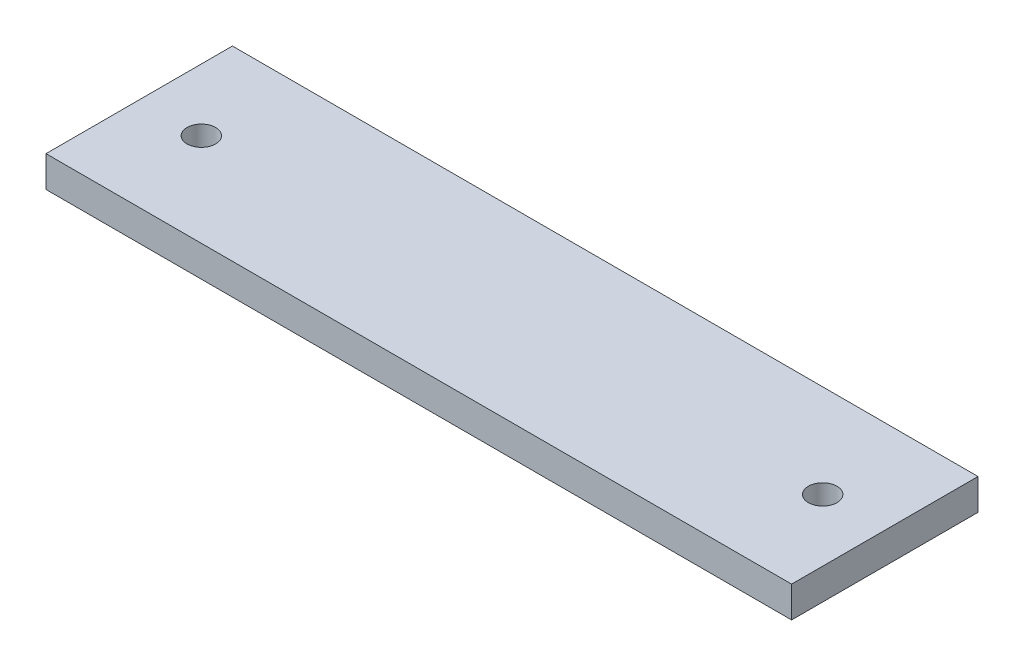
ISO-10303-21;
HEADER;
FILE_DESCRIPTION(('STEP AP214'),'2;1');
FILE_NAME('part.step','',(''),(''),'','','');
FILE_SCHEMA(('AUTOMOTIVE_DESIGN { 1 0 10303 214 1 1 1 1 }'));
ENDSEC;
DATA;
#1=APPLICATION_CONTEXT('core data for automotive mechanical design processes');
#2=APPLICATION_PROTOCOL_DEFINITION('international standard','automotive_design',2000,#1);
#3=PRODUCT_CONTEXT('',#1,'mechanical');
#4=PRODUCT('Part','Part','',(#3));
#5=PRODUCT_RELATED_PRODUCT_CATEGORY('part','',(#4));
#6=PRODUCT_DEFINITION_FORMATION('','',#4);
#7=PRODUCT_DEFINITION_CONTEXT('part definition',#1,'design');
#8=PRODUCT_DEFINITION('design','',#6,#7);
#9=PRODUCT_DEFINITION_SHAPE('','',#8);
#10=(LENGTH_UNIT() NAMED_UNIT(*) SI_UNIT(.MILLI.,.METRE.));
#11=(NAMED_UNIT(*) PLANE_ANGLE_UNIT() SI_UNIT($,.RADIAN.));
#12=(NAMED_UNIT(*) SI_UNIT($,.STERADIAN.) SOLID_ANGLE_UNIT());
#13=UNCERTAINTY_MEASURE_WITH_UNIT(LENGTH_MEASURE(1.E-05),#10,'distance_accuracy_value','');
#14=(GEOMETRIC_REPRESENTATION_CONTEXT(3) GLOBAL_UNCERTAINTY_ASSIGNED_CONTEXT((#13)) GLOBAL_UNIT_ASSIGNED_CONTEXT((#10,
#11,#12)) REPRESENTATION_CONTEXT('',''));
#15=CARTESIAN_POINT('',(0.,0.,0.));
#16=DIRECTION('',(0.,0.,1.));
#17=DIRECTION('',(1.,0.,0.));
#18=AXIS2_PLACEMENT_3D('',#15,#16,#17);
#19=CARTESIAN_POINT('',(0.,3.175,0.));
#20=DIRECTION('',(0.,-1.,0.));
#21=DIRECTION('',(0.,0.,-1.));
#22=AXIS2_PLACEMENT_3D('',#19,#20,#21);
#23=PLANE('',#22);
#24=DIRECTION('',(0.,0.,1.));
#25=VECTOR('',#24,1.);
#26=CARTESIAN_POINT('',(0.,3.175,0.));
#27=LINE('',#26,#25);
#28=CARTESIAN_POINT('',(0.,3.175,-19.05));
#29=VERTEX_POINT('',#28);
#30=CARTESIAN_POINT('',(0.,3.175,0.));
#31=VERTEX_POINT('',#30);
#32=EDGE_CURVE('E91',#29,#31,#27,.T.);
#33=ORIENTED_EDGE('',*,*,#32,.T.);
#34=DIRECTION('',(1.,0.,0.));
#35=VECTOR('',#34,1.);
#36=CARTESIAN_POINT('',(0.,3.175,0.));
#37=LINE('',#36,#35);
#38=CARTESIAN_POINT('',(76.2,3.175,0.));
#39=VERTEX_POINT('',#38);
#40=EDGE_CURVE('E86',#31,#39,#37,.T.);
#41=ORIENTED_EDGE('',*,*,#40,.T.);
#42=DIRECTION('',(0.,0.,-1.));
#43=VECTOR('',#42,1.);
#44=CARTESIAN_POINT('',(76.2,3.175,0.));
#45=LINE('',#44,#43);
#46=CARTESIAN_POINT('',(76.2,3.175,-19.05));
#47=VERTEX_POINT('',#46);
#48=EDGE_CURVE('E89',#39,#47,#45,.T.);
#49=ORIENTED_EDGE('',*,*,#48,.T.);
#50=DIRECTION('',(-1.,0.,0.));
#51=VECTOR('',#50,1.);
#52=CARTESIAN_POINT('',(0.,3.175,-19.05));
#53=LINE('',#52,#51);
#54=EDGE_CURVE('E56',#47,#29,#53,.T.);
#55=ORIENTED_EDGE('',*,*,#54,.T.);
#56=EDGE_LOOP('',(#33,#41,#49,#55));
#57=FACE_BOUND('',#56,.T.);
#58=CARTESIAN_POINT('',(6.34999999999999,3.175,-9.525));
#59=DIRECTION('',(0.,1.,0.));
#60=DIRECTION('',(0.,0.,1.));
#61=AXIS2_PLACEMENT_3D('',#58,#59,#60);
#62=CIRCLE('',#61,1.4605);
#63=CARTESIAN_POINT('',(6.34999999999999,3.175,-8.0645));
#64=VERTEX_POINT('',#63);
#65=EDGE_CURVE('E106',#64,#64,#62,.T.);
#66=ORIENTED_EDGE('',*,*,#65,.F.);
#67=EDGE_LOOP('',(#66));
#68=FACE_BOUND('',#67,.T.);
#69=CARTESIAN_POINT('',(69.85,3.175,-9.525));
#70=DIRECTION('',(0.,1.,0.));
#71=DIRECTION('',(0.,0.,1.));
#72=AXIS2_PLACEMENT_3D('',#69,#70,#71);
#73=CIRCLE('',#72,1.4605);
#74=CARTESIAN_POINT('',(69.85,3.175,-8.0645));
#75=VERTEX_POINT('',#74);
#76=EDGE_CURVE('E121',#75,#75,#73,.T.);
#77=ORIENTED_EDGE('',*,*,#76,.F.);
#78=EDGE_LOOP('',(#77));
#79=FACE_BOUND('',#78,.T.);
#80=ADVANCED_FACE('F39',(#57,#68,#79),#23,.F.);
#81=CARTESIAN_POINT('',(0.,0.,0.));
#82=DIRECTION('',(0.,-1.,0.));
#83=DIRECTION('',(0.,0.,-1.));
#84=AXIS2_PLACEMENT_3D('',#81,#82,#83);
#85=PLANE('',#84);
#86=CARTESIAN_POINT('',(6.34999999999999,0.,-9.525));
#87=DIRECTION('',(0.,1.,0.));
#88=DIRECTION('',(0.,0.,1.));
#89=AXIS2_PLACEMENT_3D('',#86,#87,#88);
#90=CIRCLE('',#89,1.4605);
#91=CARTESIAN_POINT('',(6.34999999999999,0.,-8.0645));
#92=VERTEX_POINT('',#91);
#93=EDGE_CURVE('E118',#92,#92,#90,.T.);
#94=ORIENTED_EDGE('',*,*,#93,.T.);
#95=EDGE_LOOP('',(#94));
#96=FACE_BOUND('',#95,.T.);
#97=DIRECTION('',(0.,0.,1.));
#98=VECTOR('',#97,1.);
#99=CARTESIAN_POINT('',(0.,0.,0.));
#100=LINE('',#99,#98);
#101=CARTESIAN_POINT('',(0.,0.,-19.05));
#102=VERTEX_POINT('',#101);
#103=CARTESIAN_POINT('',(0.,0.,0.));
#104=VERTEX_POINT('',#103);
#105=EDGE_CURVE('E103',#102,#104,#100,.T.);
#106=ORIENTED_EDGE('',*,*,#105,.F.);
#107=DIRECTION('',(-1.,0.,0.));
#108=VECTOR('',#107,1.);
#109=CARTESIAN_POINT('',(0.,0.,-19.05));
#110=LINE('',#109,#108);
#111=CARTESIAN_POINT('',(76.2,0.,-19.05));
#112=VERTEX_POINT('',#111);
#113=EDGE_CURVE('E79',#112,#102,#110,.T.);
#114=ORIENTED_EDGE('',*,*,#113,.F.);
#115=DIRECTION('',(0.,0.,-1.));
#116=VECTOR('',#115,1.);
#117=CARTESIAN_POINT('',(76.2,0.,0.));
#118=LINE('',#117,#116);
#119=CARTESIAN_POINT('',(76.2,0.,0.));
#120=VERTEX_POINT('',#119);
#121=EDGE_CURVE('E73',#120,#112,#118,.T.);
#122=ORIENTED_EDGE('',*,*,#121,.F.);
#123=DIRECTION('',(1.,0.,0.));
#124=VECTOR('',#123,1.);
#125=CARTESIAN_POINT('',(0.,0.,0.));
#126=LINE('',#125,#124);
#127=EDGE_CURVE('E95',#104,#120,#126,.T.);
#128=ORIENTED_EDGE('',*,*,#127,.F.);
#129=EDGE_LOOP('',(#106,#114,#122,#128));
#130=FACE_BOUND('',#129,.T.);
#131=CARTESIAN_POINT('',(69.85,0.,-9.525));
#132=DIRECTION('',(0.,1.,0.));
#133=DIRECTION('',(0.,0.,1.));
#134=AXIS2_PLACEMENT_3D('',#131,#132,#133);
#135=CIRCLE('',#134,1.4605);
#136=CARTESIAN_POINT('',(69.85,0.,-8.0645));
#137=VERTEX_POINT('',#136);
#138=EDGE_CURVE('E124',#137,#137,#135,.T.);
#139=ORIENTED_EDGE('',*,*,#138,.T.);
#140=EDGE_LOOP('',(#139));
#141=FACE_BOUND('',#140,.T.);
#142=ADVANCED_FACE('F114',(#96,#130,#141),#85,.T.);
#143=CARTESIAN_POINT('',(0.,3.175,0.));
#144=DIRECTION('',(1.,0.,0.));
#145=DIRECTION('',(0.,0.,-1.));
#146=AXIS2_PLACEMENT_3D('',#143,#144,#145);
#147=PLANE('',#146);
#148=ORIENTED_EDGE('',*,*,#105,.T.);
#149=DIRECTION('',(0.,-1.,0.));
#150=VECTOR('',#149,1.);
#151=CARTESIAN_POINT('',(0.,3.175,0.));
#152=LINE('',#151,#150);
#153=EDGE_CURVE('E11',#31,#104,#152,.T.);
#154=ORIENTED_EDGE('',*,*,#153,.F.);
#155=ORIENTED_EDGE('',*,*,#32,.F.);
#156=DIRECTION('',(0.,-1.,0.));
#157=VECTOR('',#156,1.);
#158=CARTESIAN_POINT('',(0.,3.175,-19.05));
#159=LINE('',#158,#157);
#160=EDGE_CURVE('E99',#29,#102,#159,.T.);
#161=ORIENTED_EDGE('',*,*,#160,.T.);
#162=EDGE_LOOP('',(#148,#154,#155,#161));
#163=FACE_BOUND('',#162,.T.);
#164=ADVANCED_FACE('F41',(#163),#147,.F.);
#165=CARTESIAN_POINT('',(0.,3.175,0.));
#166=DIRECTION('',(0.,0.,-1.));
#167=DIRECTION('',(-1.,0.,0.));
#168=AXIS2_PLACEMENT_3D('',#165,#166,#167);
#169=PLANE('',#168);
#170=ORIENTED_EDGE('',*,*,#127,.T.);
#171=DIRECTION('',(0.,-1.,0.));
#172=VECTOR('',#171,1.);
#173=CARTESIAN_POINT('',(76.2,3.175,0.));
#174=LINE('',#173,#172);
#175=EDGE_CURVE('E48',#39,#120,#174,.T.);
#176=ORIENTED_EDGE('',*,*,#175,.F.);
#177=ORIENTED_EDGE('',*,*,#40,.F.);
#178=ORIENTED_EDGE('',*,*,#153,.T.);
#179=EDGE_LOOP('',(#170,#176,#177,#178));
#180=FACE_BOUND('',#179,.T.);
#181=ADVANCED_FACE('F94',(#180),#169,.F.);
#182=CARTESIAN_POINT('',(76.2,3.175,0.));
#183=DIRECTION('',(-1.,0.,0.));
#184=DIRECTION('',(0.,0.,1.));
#185=AXIS2_PLACEMENT_3D('',#182,#183,#184);
#186=PLANE('',#185);
#187=ORIENTED_EDGE('',*,*,#121,.T.);
#188=DIRECTION('',(0.,-1.,0.));
#189=VECTOR('',#188,1.);
#190=CARTESIAN_POINT('',(76.2,3.175,-19.05));
#191=LINE('',#190,#189);
#192=EDGE_CURVE('E96',#47,#112,#191,.T.);
#193=ORIENTED_EDGE('',*,*,#192,.F.);
#194=ORIENTED_EDGE('',*,*,#48,.F.);
#195=ORIENTED_EDGE('',*,*,#175,.T.);
#196=EDGE_LOOP('',(#187,#193,#194,#195));
#197=FACE_BOUND('',#196,.T.);
#198=ADVANCED_FACE('F97',(#197),#186,.F.);
#199=CARTESIAN_POINT('',(0.,3.175,-19.05));
#200=DIRECTION('',(0.,0.,1.));
#201=DIRECTION('',(1.,0.,0.));
#202=AXIS2_PLACEMENT_3D('',#199,#200,#201);
#203=PLANE('',#202);
#204=ORIENTED_EDGE('',*,*,#113,.T.);
#205=ORIENTED_EDGE('',*,*,#160,.F.);
#206=ORIENTED_EDGE('',*,*,#54,.F.);
#207=ORIENTED_EDGE('',*,*,#192,.T.);
#208=EDGE_LOOP('',(#204,#205,#206,#207));
#209=FACE_BOUND('',#208,.T.);
#210=ADVANCED_FACE('F111',(#209),#203,.F.);
#211=CARTESIAN_POINT('',(6.34999999999999,3.175,-9.525));
#212=DIRECTION('',(0.,-1.,0.));
#213=DIRECTION('',(0.,0.,-1.));
#214=AXIS2_PLACEMENT_3D('',#211,#212,#213);
#215=CYLINDRICAL_SURFACE('',#214,1.4605);
#216=ORIENTED_EDGE('',*,*,#65,.T.);
#217=EDGE_LOOP('',(#216));
#218=FACE_BOUND('',#217,.T.);
#219=ORIENTED_EDGE('',*,*,#93,.F.);
#220=EDGE_LOOP('',(#219));
#221=FACE_BOUND('',#220,.T.);
#222=ADVANCED_FACE('F141',(#218,#221),#215,.F.);
#223=CARTESIAN_POINT('',(69.85,3.175,-9.525));
#224=DIRECTION('',(0.,-1.,0.));
#225=DIRECTION('',(0.,0.,-1.));
#226=AXIS2_PLACEMENT_3D('',#223,#224,#225);
#227=CYLINDRICAL_SURFACE('',#226,1.4605);
#228=ORIENTED_EDGE('',*,*,#76,.T.);
#229=EDGE_LOOP('',(#228));
#230=FACE_BOUND('',#229,.T.);
#231=ORIENTED_EDGE('',*,*,#138,.F.);
#232=EDGE_LOOP('',(#231));
#233=FACE_BOUND('',#232,.T.);
#234=ADVANCED_FACE('F130',(#230,#233),#227,.F.);
#235=CLOSED_SHELL('',(#80,#142,#164,#181,#198,#210,#222,#234));
#236=MANIFOLD_SOLID_BREP('B2',#235);
#237=ADVANCED_BREP_SHAPE_REPRESENTATION('',(#18,#236),#14);
#238=SHAPE_DEFINITION_REPRESENTATION(#9,#237);
ENDSEC;
END-ISO-10303-21;
